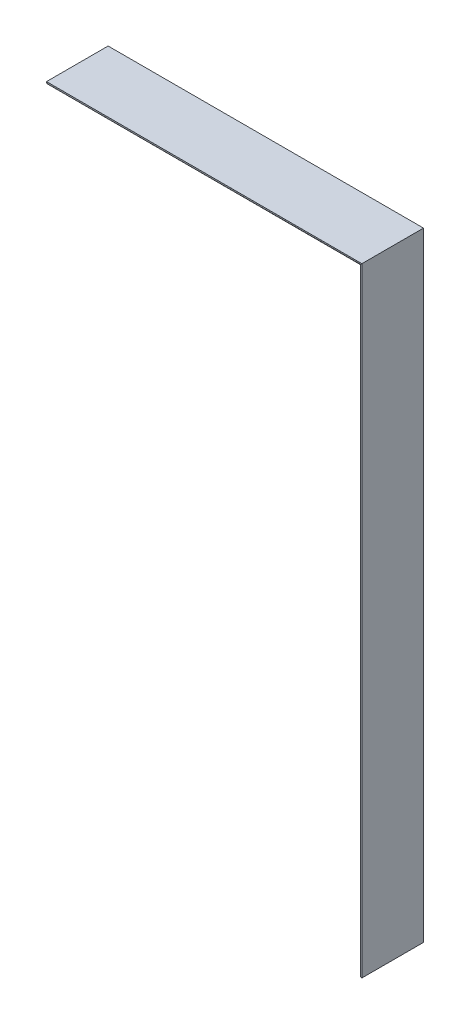
ISO-10303-21;
HEADER;
FILE_DESCRIPTION(('STEP AP214'),'2;1');
FILE_NAME('part.step','',(''),(''),'','','');
FILE_SCHEMA(('AUTOMOTIVE_DESIGN { 1 0 10303 214 1 1 1 1 }'));
ENDSEC;
DATA;
#1=APPLICATION_CONTEXT('core data for automotive mechanical design processes');
#2=APPLICATION_PROTOCOL_DEFINITION('international standard','automotive_design',2000,#1);
#3=PRODUCT_CONTEXT('',#1,'mechanical');
#4=PRODUCT('Part','Part','',(#3));
#5=PRODUCT_RELATED_PRODUCT_CATEGORY('part','',(#4));
#6=PRODUCT_DEFINITION_FORMATION('','',#4);
#7=PRODUCT_DEFINITION_CONTEXT('part definition',#1,'design');
#8=PRODUCT_DEFINITION('design','',#6,#7);
#9=PRODUCT_DEFINITION_SHAPE('','',#8);
#10=(LENGTH_UNIT() NAMED_UNIT(*) SI_UNIT(.MILLI.,.METRE.));
#11=(NAMED_UNIT(*) PLANE_ANGLE_UNIT() SI_UNIT($,.RADIAN.));
#12=(NAMED_UNIT(*) SI_UNIT($,.STERADIAN.) SOLID_ANGLE_UNIT());
#13=UNCERTAINTY_MEASURE_WITH_UNIT(LENGTH_MEASURE(1.E-05),#10,'distance_accuracy_value','');
#14=(GEOMETRIC_REPRESENTATION_CONTEXT(3) GLOBAL_UNCERTAINTY_ASSIGNED_CONTEXT((#13)) GLOBAL_UNIT_ASSIGNED_CONTEXT((#10,
#11,#12)) REPRESENTATION_CONTEXT('',''));
#15=CARTESIAN_POINT('',(0.,0.,0.));
#16=DIRECTION('',(0.,0.,1.));
#17=DIRECTION('',(1.,0.,0.));
#18=AXIS2_PLACEMENT_3D('',#15,#16,#17);
#19=CARTESIAN_POINT('',(-50.8,0.,0.));
#20=DIRECTION('',(0.,0.,1.));
#21=DIRECTION('',(1.,0.,0.));
#22=AXIS2_PLACEMENT_3D('',#19,#20,#21);
#23=PLANE('',#22);
#24=DIRECTION('',(-0.707106781186547,-0.707106781186548,0.));
#25=VECTOR('',#24,1.);
#26=CARTESIAN_POINT('',(-25.4,-25.4,0.));
#27=LINE('',#26,#25);
#28=CARTESIAN_POINT('',(0.,0.,0.));
#29=VERTEX_POINT('',#28);
#30=CARTESIAN_POINT('',(-50.8,-50.8,0.));
#31=VERTEX_POINT('',#30);
#32=EDGE_CURVE('E185',#29,#31,#27,.T.);
#33=ORIENTED_EDGE('',*,*,#32,.F.);
#34=DIRECTION('',(0.,-1.,0.));
#35=VECTOR('',#34,1.);
#36=CARTESIAN_POINT('',(0.,0.,0.));
#37=LINE('',#36,#35);
#38=CARTESIAN_POINT('',(0.,-510.,0.));
#39=VERTEX_POINT('',#38);
#40=EDGE_CURVE('E81',#29,#39,#37,.T.);
#41=ORIENTED_EDGE('',*,*,#40,.T.);
#42=DIRECTION('',(-1.,0.,0.));
#43=VECTOR('',#42,1.);
#44=CARTESIAN_POINT('',(-50.7999999999999,-510.,0.));
#45=LINE('',#44,#43);
#46=CARTESIAN_POINT('',(-50.7999999999999,-510.,0.));
#47=VERTEX_POINT('',#46);
#48=EDGE_CURVE('E193',#39,#47,#45,.T.);
#49=ORIENTED_EDGE('',*,*,#48,.T.);
#50=DIRECTION('',(0.,-1.,0.));
#51=VECTOR('',#50,1.);
#52=CARTESIAN_POINT('',(-50.8,0.,0.));
#53=LINE('',#52,#51);
#54=EDGE_CURVE('E136',#31,#47,#53,.T.);
#55=ORIENTED_EDGE('',*,*,#54,.F.);
#56=EDGE_LOOP('',(#33,#41,#49,#55));
#57=FACE_BOUND('',#56,.T.);
#58=ADVANCED_FACE('F77',(#57),#23,.F.);
#59=CARTESIAN_POINT('',(-50.8,0.,0.00508));
#60=DIRECTION('',(1.,0.,0.));
#61=DIRECTION('',(0.,1.,0.));
#62=AXIS2_PLACEMENT_3D('',#59,#60,#61);
#63=PLANE('',#62);
#64=DIRECTION('',(0.,0.,1.));
#65=VECTOR('',#64,1.);
#66=CARTESIAN_POINT('',(-50.8,-50.8,0.00508));
#67=LINE('',#66,#65);
#68=CARTESIAN_POINT('',(-50.8,-50.8,0.00508));
#69=VERTEX_POINT('',#68);
#70=EDGE_CURVE('E143',#31,#69,#67,.T.);
#71=ORIENTED_EDGE('',*,*,#70,.F.);
#72=ORIENTED_EDGE('',*,*,#54,.T.);
#73=DIRECTION('',(0.,0.,1.));
#74=VECTOR('',#73,1.);
#75=CARTESIAN_POINT('',(-50.7999999999999,-510.,0.00508));
#76=LINE('',#75,#74);
#77=CARTESIAN_POINT('',(-50.7999999999999,-510.,0.00508));
#78=VERTEX_POINT('',#77);
#79=EDGE_CURVE('E192',#47,#78,#76,.T.);
#80=ORIENTED_EDGE('',*,*,#79,.T.);
#81=DIRECTION('',(0.,-1.,0.));
#82=VECTOR('',#81,1.);
#83=CARTESIAN_POINT('',(-50.8,0.,0.00508));
#84=LINE('',#83,#82);
#85=EDGE_CURVE('E194',#69,#78,#84,.T.);
#86=ORIENTED_EDGE('',*,*,#85,.F.);
#87=EDGE_LOOP('',(#71,#72,#80,#86));
#88=FACE_BOUND('',#87,.T.);
#89=ADVANCED_FACE('F228',(#88),#63,.F.);
#90=CARTESIAN_POINT('',(-47.63008,0.,0.00507999999999961));
#91=DIRECTION('',(0.,-1.,0.));
#92=DIRECTION('',(1.,0.,0.));
#93=AXIS2_PLACEMENT_3D('',#90,#91,#92);
#94=CYLINDRICAL_SURFACE('',#93,3.16992);
#95=CARTESIAN_POINT('',(-47.63008,-47.63008,0.00507999999999961));
#96=DIRECTION('',(-0.707106781186548,0.707106781186547,0.));
#97=DIRECTION('',(-0.707106781186547,-0.707106781186548,0.));
#98=AXIS2_PLACEMENT_3D('',#95,#96,#97);
#99=ELLIPSE('',#98,4.48294385563772,3.16992);
#100=CARTESIAN_POINT('',(-47.63008,-47.63008,3.175));
#101=VERTEX_POINT('',#100);
#102=EDGE_CURVE('E181',#69,#101,#99,.T.);
#103=ORIENTED_EDGE('',*,*,#102,.F.);
#104=ORIENTED_EDGE('',*,*,#85,.T.);
#105=CARTESIAN_POINT('',(-47.6300799999999,-510.,0.00507999999999961));
#106=DIRECTION('',(0.,1.,0.));
#107=DIRECTION('',(-1.,0.,0.));
#108=AXIS2_PLACEMENT_3D('',#105,#106,#107);
#109=CIRCLE('',#108,3.16992);
#110=CARTESIAN_POINT('',(-47.6300799999999,-510.,3.175));
#111=VERTEX_POINT('',#110);
#112=EDGE_CURVE('E196',#78,#111,#109,.T.);
#113=ORIENTED_EDGE('',*,*,#112,.T.);
#114=DIRECTION('',(0.,-1.,0.));
#115=VECTOR('',#114,1.);
#116=CARTESIAN_POINT('',(-47.63008,0.,3.175));
#117=LINE('',#116,#115);
#118=EDGE_CURVE('E197',#101,#111,#117,.T.);
#119=ORIENTED_EDGE('',*,*,#118,.F.);
#120=EDGE_LOOP('',(#103,#104,#113,#119));
#121=FACE_BOUND('',#120,.T.);
#122=ADVANCED_FACE('F231',(#121),#94,.T.);
#123=CARTESIAN_POINT('',(-7.93750000000001,0.,3.17499999999999));
#124=DIRECTION('',(0.,0.,-1.));
#125=DIRECTION('',(-1.,0.,0.));
#126=AXIS2_PLACEMENT_3D('',#123,#124,#125);
#127=PLANE('',#126);
#128=DIRECTION('',(0.707106781186547,0.707106781186548,0.));
#129=VECTOR('',#128,1.);
#130=CARTESIAN_POINT('',(-3.96875000000001,-3.96875000000001,3.17499999999999));
#131=LINE('',#130,#129);
#132=CARTESIAN_POINT('',(-7.93750000000001,-7.93750000000002,3.17499999999999));
#133=VERTEX_POINT('',#132);
#134=EDGE_CURVE('E178',#101,#133,#131,.T.);
#135=ORIENTED_EDGE('',*,*,#134,.F.);
#136=ORIENTED_EDGE('',*,*,#118,.T.);
#137=DIRECTION('',(1.,0.,0.));
#138=VECTOR('',#137,1.);
#139=CARTESIAN_POINT('',(-7.93749999999995,-510.,3.17499999999999));
#140=LINE('',#139,#138);
#141=CARTESIAN_POINT('',(-7.93749999999995,-510.,3.17499999999999));
#142=VERTEX_POINT('',#141);
#143=EDGE_CURVE('E199',#111,#142,#140,.T.);
#144=ORIENTED_EDGE('',*,*,#143,.T.);
#145=DIRECTION('',(0.,-1.,0.));
#146=VECTOR('',#145,1.);
#147=CARTESIAN_POINT('',(-7.93750000000002,0.,3.17499999999999));
#148=LINE('',#147,#146);
#149=EDGE_CURVE('E200',#133,#142,#148,.T.);
#150=ORIENTED_EDGE('',*,*,#149,.F.);
#151=EDGE_LOOP('',(#135,#136,#144,#150));
#152=FACE_BOUND('',#151,.T.);
#153=ADVANCED_FACE('F233',(#152),#127,.F.);
#154=CARTESIAN_POINT('',(-7.93750000000001,0.,7.93749999999999));
#155=DIRECTION('',(0.,-1.,0.));
#156=DIRECTION('',(1.,0.,0.));
#157=AXIS2_PLACEMENT_3D('',#154,#155,#156);
#158=CYLINDRICAL_SURFACE('',#157,4.7625);
#159=CARTESIAN_POINT('',(-7.93750000000001,-7.93750000000001,7.93749999999999));
#160=DIRECTION('',(-0.707106781186548,0.707106781186547,0.));
#161=DIRECTION('',(-0.707106781186547,-0.707106781186548,0.));
#162=AXIS2_PLACEMENT_3D('',#159,#160,#161);
#163=ELLIPSE('',#162,6.73519209080187,4.7625);
#164=CARTESIAN_POINT('',(-3.17500000000001,-3.17500000000001,7.93749999999999));
#165=VERTEX_POINT('',#164);
#166=EDGE_CURVE('E173',#133,#165,#163,.F.);
#167=ORIENTED_EDGE('',*,*,#166,.F.);
#168=ORIENTED_EDGE('',*,*,#149,.T.);
#169=CARTESIAN_POINT('',(-7.93749999999995,-510.,7.93749999999999));
#170=DIRECTION('',(0.,-1.,0.));
#171=DIRECTION('',(1.,0.,0.));
#172=AXIS2_PLACEMENT_3D('',#169,#170,#171);
#173=CIRCLE('',#172,4.7625);
#174=CARTESIAN_POINT('',(-3.17499999999995,-510.,7.93749999999999));
#175=VERTEX_POINT('',#174);
#176=EDGE_CURVE('E202',#142,#175,#173,.T.);
#177=ORIENTED_EDGE('',*,*,#176,.T.);
#178=DIRECTION('',(0.,-1.,0.));
#179=VECTOR('',#178,1.);
#180=CARTESIAN_POINT('',(-3.17500000000001,0.,7.93749999999999));
#181=LINE('',#180,#179);
#182=EDGE_CURVE('E203',#165,#175,#181,.T.);
#183=ORIENTED_EDGE('',*,*,#182,.F.);
#184=EDGE_LOOP('',(#167,#168,#177,#183));
#185=FACE_BOUND('',#184,.T.);
#186=ADVANCED_FACE('F237',(#185),#158,.F.);
#187=CARTESIAN_POINT('',(-3.175,0.,47.63008));
#188=DIRECTION('',(1.,0.,0.));
#189=DIRECTION('',(0.,0.,-1.));
#190=AXIS2_PLACEMENT_3D('',#187,#188,#189);
#191=PLANE('',#190);
#192=DIRECTION('',(0.,0.,1.));
#193=VECTOR('',#192,1.);
#194=CARTESIAN_POINT('',(-3.175,-3.175,47.63008));
#195=LINE('',#194,#193);
#196=CARTESIAN_POINT('',(-3.17499999999999,-3.175,47.63008));
#197=VERTEX_POINT('',#196);
#198=EDGE_CURVE('E171',#165,#197,#195,.T.);
#199=ORIENTED_EDGE('',*,*,#198,.F.);
#200=ORIENTED_EDGE('',*,*,#182,.T.);
#201=DIRECTION('',(0.,0.,1.));
#202=VECTOR('',#201,1.);
#203=CARTESIAN_POINT('',(-3.17499999999994,-510.,47.63008));
#204=LINE('',#203,#202);
#205=CARTESIAN_POINT('',(-3.17499999999993,-510.,47.63008));
#206=VERTEX_POINT('',#205);
#207=EDGE_CURVE('E205',#175,#206,#204,.T.);
#208=ORIENTED_EDGE('',*,*,#207,.T.);
#209=DIRECTION('',(0.,-1.,0.));
#210=VECTOR('',#209,1.);
#211=CARTESIAN_POINT('',(-3.175,0.,47.63008));
#212=LINE('',#211,#210);
#213=EDGE_CURVE('E206',#197,#206,#212,.T.);
#214=ORIENTED_EDGE('',*,*,#213,.F.);
#215=EDGE_LOOP('',(#199,#200,#208,#214));
#216=FACE_BOUND('',#215,.T.);
#217=ADVANCED_FACE('F241',(#216),#191,.F.);
#218=CARTESIAN_POINT('',(-0.00508000000000019,0.,47.63008));
#219=DIRECTION('',(0.,-1.,0.));
#220=DIRECTION('',(1.,0.,0.));
#221=AXIS2_PLACEMENT_3D('',#218,#219,#220);
#222=CYLINDRICAL_SURFACE('',#221,3.16992);
#223=CARTESIAN_POINT('',(-0.00508000000000019,-0.00508000000000019,47.63008));
#224=DIRECTION('',(-0.707106781186548,0.707106781186547,0.));
#225=DIRECTION('',(-0.707106781186547,-0.707106781186548,0.));
#226=AXIS2_PLACEMENT_3D('',#223,#224,#225);
#227=ELLIPSE('',#226,4.48294385563772,3.16992);
#228=CARTESIAN_POINT('',(-0.00508,-0.00508,50.8));
#229=VERTEX_POINT('',#228);
#230=EDGE_CURVE('E86',#197,#229,#227,.T.);
#231=ORIENTED_EDGE('',*,*,#230,.F.);
#232=ORIENTED_EDGE('',*,*,#213,.T.);
#233=CARTESIAN_POINT('',(-0.00507999999993774,-510.,47.63008));
#234=DIRECTION('',(0.,1.,0.));
#235=DIRECTION('',(1.,0.,0.));
#236=AXIS2_PLACEMENT_3D('',#233,#234,#235);
#237=CIRCLE('',#236,3.16992);
#238=CARTESIAN_POINT('',(-0.00507999999993754,-510.,50.8));
#239=VERTEX_POINT('',#238);
#240=EDGE_CURVE('E165',#206,#239,#237,.T.);
#241=ORIENTED_EDGE('',*,*,#240,.T.);
#242=DIRECTION('',(0.,-1.,0.));
#243=VECTOR('',#242,1.);
#244=CARTESIAN_POINT('',(-0.00508,0.,50.8));
#245=LINE('',#244,#243);
#246=EDGE_CURVE('E156',#229,#239,#245,.T.);
#247=ORIENTED_EDGE('',*,*,#246,.F.);
#248=EDGE_LOOP('',(#231,#232,#241,#247));
#249=FACE_BOUND('',#248,.T.);
#250=ADVANCED_FACE('F162',(#249),#222,.T.);
#251=CARTESIAN_POINT('',(0.,0.,50.8));
#252=DIRECTION('',(0.,0.,-1.));
#253=DIRECTION('',(-1.,0.,0.));
#254=AXIS2_PLACEMENT_3D('',#251,#252,#253);
#255=PLANE('',#254);
#256=DIRECTION('',(0.707106781186547,0.707106781186548,0.));
#257=VECTOR('',#256,1.);
#258=CARTESIAN_POINT('',(0.,0.,50.8));
#259=LINE('',#258,#257);
#260=CARTESIAN_POINT('',(0.,0.,50.8));
#261=VERTEX_POINT('',#260);
#262=EDGE_CURVE('E14',#229,#261,#259,.T.);
#263=ORIENTED_EDGE('',*,*,#262,.F.);
#264=ORIENTED_EDGE('',*,*,#246,.T.);
#265=DIRECTION('',(1.,0.,0.));
#266=VECTOR('',#265,1.);
#267=CARTESIAN_POINT('',(0.,-510.,50.8));
#268=LINE('',#267,#266);
#269=CARTESIAN_POINT('',(0.,-510.,50.8));
#270=VERTEX_POINT('',#269);
#271=EDGE_CURVE('E167',#239,#270,#268,.T.);
#272=ORIENTED_EDGE('',*,*,#271,.T.);
#273=DIRECTION('',(0.,-1.,0.));
#274=VECTOR('',#273,1.);
#275=CARTESIAN_POINT('',(0.,0.,50.8));
#276=LINE('',#275,#274);
#277=EDGE_CURVE('E99',#261,#270,#276,.T.);
#278=ORIENTED_EDGE('',*,*,#277,.F.);
#279=EDGE_LOOP('',(#263,#264,#272,#278));
#280=FACE_BOUND('',#279,.T.);
#281=ADVANCED_FACE('F155',(#280),#255,.F.);
#282=CARTESIAN_POINT('',(0.,0.,0.));
#283=DIRECTION('',(-1.,0.,0.));
#284=DIRECTION('',(0.,-1.,0.));
#285=AXIS2_PLACEMENT_3D('',#282,#283,#284);
#286=PLANE('',#285);
#287=DIRECTION('',(0.,0.,-1.));
#288=VECTOR('',#287,1.);
#289=CARTESIAN_POINT('',(0.,0.,0.));
#290=LINE('',#289,#288);
#291=EDGE_CURVE('E188',#261,#29,#290,.T.);
#292=ORIENTED_EDGE('',*,*,#291,.F.);
#293=ORIENTED_EDGE('',*,*,#277,.T.);
#294=DIRECTION('',(0.,0.,-1.));
#295=VECTOR('',#294,1.);
#296=CARTESIAN_POINT('',(0.,-510.,0.));
#297=LINE('',#296,#295);
#298=EDGE_CURVE('E190',#270,#39,#297,.T.);
#299=ORIENTED_EDGE('',*,*,#298,.T.);
#300=ORIENTED_EDGE('',*,*,#40,.F.);
#301=EDGE_LOOP('',(#292,#293,#299,#300));
#302=FACE_BOUND('',#301,.T.);
#303=ADVANCED_FACE('F223',(#302),#286,.F.);
#304=CARTESIAN_POINT('',(-0.00507999999993774,-510.,47.63008));
#305=DIRECTION('',(0.,-1.,0.));
#306=DIRECTION('',(1.,0.,0.));
#307=AXIS2_PLACEMENT_3D('',#304,#305,#306);
#308=PLANE('',#307);
#309=ORIENTED_EDGE('',*,*,#48,.F.);
#310=ORIENTED_EDGE('',*,*,#298,.F.);
#311=ORIENTED_EDGE('',*,*,#271,.F.);
#312=ORIENTED_EDGE('',*,*,#240,.F.);
#313=ORIENTED_EDGE('',*,*,#207,.F.);
#314=ORIENTED_EDGE('',*,*,#176,.F.);
#315=ORIENTED_EDGE('',*,*,#143,.F.);
#316=ORIENTED_EDGE('',*,*,#112,.F.);
#317=ORIENTED_EDGE('',*,*,#79,.F.);
#318=EDGE_LOOP('',(#309,#310,#311,#312,#313,#314,#315,#316,#317));
#319=FACE_BOUND('',#318,.T.);
#320=ADVANCED_FACE('F225',(#319),#308,.T.);
#321=CARTESIAN_POINT('',(0.,0.,0.));
#322=DIRECTION('',(-0.707106781186548,0.707106781186547,0.));
#323=DIRECTION('',(-0.707106781186547,-0.707106781186548,0.));
#324=AXIS2_PLACEMENT_3D('',#321,#322,#323);
#325=PLANE('',#324);
#326=ORIENTED_EDGE('',*,*,#291,.T.);
#327=ORIENTED_EDGE('',*,*,#32,.T.);
#328=ORIENTED_EDGE('',*,*,#70,.T.);
#329=ORIENTED_EDGE('',*,*,#102,.T.);
#330=ORIENTED_EDGE('',*,*,#134,.T.);
#331=ORIENTED_EDGE('',*,*,#166,.T.);
#332=ORIENTED_EDGE('',*,*,#198,.T.);
#333=ORIENTED_EDGE('',*,*,#230,.T.);
#334=ORIENTED_EDGE('',*,*,#262,.T.);
#335=EDGE_LOOP('',(#326,#327,#328,#329,#330,#331,#332,#333,#334));
#336=FACE_BOUND('',#335,.T.);
#337=ADVANCED_FACE('F79',(#336),#325,.T.);
#338=CLOSED_SHELL('',(#58,#89,#122,#153,#186,#217,#250,#281,#303,#320,#337));
#339=MANIFOLD_SOLID_BREP('B2',#338);
#340=CARTESIAN_POINT('',(-260.,-50.8,0.));
#341=DIRECTION('',(0.,0.,1.));
#342=DIRECTION('',(1.,0.,0.));
#343=AXIS2_PLACEMENT_3D('',#340,#341,#342);
#344=PLANE('',#343);
#345=DIRECTION('',(0.707106781186547,0.707106781186548,0.));
#346=VECTOR('',#345,1.);
#347=CARTESIAN_POINT('',(-155.4,-155.4,0.));
#348=LINE('',#347,#346);
#349=CARTESIAN_POINT('',(-50.8,-50.8,0.));
#350=VERTEX_POINT('',#349);
#351=CARTESIAN_POINT('',(0.,0.,0.));
#352=VERTEX_POINT('',#351);
#353=EDGE_CURVE('E470',#350,#352,#348,.T.);
#354=ORIENTED_EDGE('',*,*,#353,.F.);
#355=DIRECTION('',(1.,0.,0.));
#356=VECTOR('',#355,1.);
#357=CARTESIAN_POINT('',(-260.,-50.8,0.));
#358=LINE('',#357,#356);
#359=CARTESIAN_POINT('',(-260.,-50.8,0.));
#360=VERTEX_POINT('',#359);
#361=EDGE_CURVE('E475',#360,#350,#358,.T.);
#362=ORIENTED_EDGE('',*,*,#361,.F.);
#363=DIRECTION('',(0.,-1.,0.));
#364=VECTOR('',#363,1.);
#365=CARTESIAN_POINT('',(-260.,-50.8,0.));
#366=LINE('',#365,#364);
#367=CARTESIAN_POINT('',(-260.,0.,0.));
#368=VERTEX_POINT('',#367);
#369=EDGE_CURVE('E462',#368,#360,#366,.T.);
#370=ORIENTED_EDGE('',*,*,#369,.F.);
#371=DIRECTION('',(1.,0.,0.));
#372=VECTOR('',#371,1.);
#373=CARTESIAN_POINT('',(-260.,0.,0.));
#374=LINE('',#373,#372);
#375=EDGE_CURVE('E371',#368,#352,#374,.T.);
#376=ORIENTED_EDGE('',*,*,#375,.T.);
#377=EDGE_LOOP('',(#354,#362,#370,#376));
#378=FACE_BOUND('',#377,.T.);
#379=ADVANCED_FACE('F367',(#378),#344,.F.);
#380=CARTESIAN_POINT('',(-260.,-50.8,0.00508));
#381=DIRECTION('',(0.,1.,0.));
#382=DIRECTION('',(-1.,0.,0.));
#383=AXIS2_PLACEMENT_3D('',#380,#381,#382);
#384=PLANE('',#383);
#385=DIRECTION('',(0.,0.,-1.));
#386=VECTOR('',#385,1.);
#387=CARTESIAN_POINT('',(-50.8,-50.8,0.00508));
#388=LINE('',#387,#386);
#389=CARTESIAN_POINT('',(-50.8,-50.8,0.00508));
#390=VERTEX_POINT('',#389);
#391=EDGE_CURVE('E425',#390,#350,#388,.T.);
#392=ORIENTED_EDGE('',*,*,#391,.F.);
#393=DIRECTION('',(1.,0.,0.));
#394=VECTOR('',#393,1.);
#395=CARTESIAN_POINT('',(-260.,-50.8,0.00508));
#396=LINE('',#395,#394);
#397=CARTESIAN_POINT('',(-260.,-50.8,0.00508));
#398=VERTEX_POINT('',#397);
#399=EDGE_CURVE('E477',#398,#390,#396,.T.);
#400=ORIENTED_EDGE('',*,*,#399,.F.);
#401=DIRECTION('',(0.,0.,1.));
#402=VECTOR('',#401,1.);
#403=CARTESIAN_POINT('',(-260.,-50.8,0.00508));
#404=LINE('',#403,#402);
#405=EDGE_CURVE('E417',#360,#398,#404,.T.);
#406=ORIENTED_EDGE('',*,*,#405,.F.);
#407=ORIENTED_EDGE('',*,*,#361,.T.);
#408=EDGE_LOOP('',(#392,#400,#406,#407));
#409=FACE_BOUND('',#408,.T.);
#410=ADVANCED_FACE('F528',(#409),#384,.F.);
#411=CARTESIAN_POINT('',(-260.,-47.63008,0.00507999999999961));
#412=DIRECTION('',(1.,0.,0.));
#413=DIRECTION('',(0.,1.,0.));
#414=AXIS2_PLACEMENT_3D('',#411,#412,#413);
#415=CYLINDRICAL_SURFACE('',#414,3.16992);
#416=CARTESIAN_POINT('',(-47.63008,-47.63008,0.00507999999999961));
#417=DIRECTION('',(0.707106781186548,-0.707106781186547,0.));
#418=DIRECTION('',(0.707106781186547,0.707106781186548,0.));
#419=AXIS2_PLACEMENT_3D('',#416,#417,#418);
#420=ELLIPSE('',#419,4.48294385563772,3.16992);
#421=CARTESIAN_POINT('',(-47.63008,-47.63008,3.175));
#422=VERTEX_POINT('',#421);
#423=EDGE_CURVE('E75',#422,#390,#420,.T.);
#424=ORIENTED_EDGE('',*,*,#423,.F.);
#425=DIRECTION('',(1.,0.,0.));
#426=VECTOR('',#425,1.);
#427=CARTESIAN_POINT('',(-260.,-47.63008,3.175));
#428=LINE('',#427,#426);
#429=CARTESIAN_POINT('',(-260.,-47.63008,3.175));
#430=VERTEX_POINT('',#429);
#431=EDGE_CURVE('E479',#430,#422,#428,.T.);
#432=ORIENTED_EDGE('',*,*,#431,.F.);
#433=CARTESIAN_POINT('',(-260.,-47.63008,0.00507999999999961));
#434=DIRECTION('',(-1.,0.,0.));
#435=DIRECTION('',(0.,-1.,0.));
#436=AXIS2_PLACEMENT_3D('',#433,#434,#435);
#437=CIRCLE('',#436,3.16992);
#438=EDGE_CURVE('E503',#398,#430,#437,.T.);
#439=ORIENTED_EDGE('',*,*,#438,.F.);
#440=ORIENTED_EDGE('',*,*,#399,.T.);
#441=EDGE_LOOP('',(#424,#432,#439,#440));
#442=FACE_BOUND('',#441,.T.);
#443=ADVANCED_FACE('F527',(#442),#415,.T.);
#444=CARTESIAN_POINT('',(-260.,-7.93750000000005,3.17499999999999));
#445=DIRECTION('',(0.,0.,-1.));
#446=DIRECTION('',(0.,1.,0.));
#447=AXIS2_PLACEMENT_3D('',#444,#445,#446);
#448=PLANE('',#447);
#449=DIRECTION('',(-0.707106781186547,-0.707106781186548,0.));
#450=VECTOR('',#449,1.);
#451=CARTESIAN_POINT('',(-133.96875,-133.96875,3.17500000000001));
#452=LINE('',#451,#450);
#453=CARTESIAN_POINT('',(-7.93749999999999,-7.93750000000002,3.17499999999999));
#454=VERTEX_POINT('',#453);
#455=EDGE_CURVE('E377',#454,#422,#452,.T.);
#456=ORIENTED_EDGE('',*,*,#455,.F.);
#457=DIRECTION('',(1.,0.,0.));
#458=VECTOR('',#457,1.);
#459=CARTESIAN_POINT('',(-260.,-7.93750000000005,3.17499999999999));
#460=LINE('',#459,#458);
#461=CARTESIAN_POINT('',(-260.,-7.93750000000005,3.17499999999999));
#462=VERTEX_POINT('',#461);
#463=EDGE_CURVE('E482',#462,#454,#460,.T.);
#464=ORIENTED_EDGE('',*,*,#463,.F.);
#465=DIRECTION('',(0.,1.,0.));
#466=VECTOR('',#465,1.);
#467=CARTESIAN_POINT('',(-260.,-7.93750000000005,3.17499999999999));
#468=LINE('',#467,#466);
#469=EDGE_CURVE('E505',#430,#462,#468,.T.);
#470=ORIENTED_EDGE('',*,*,#469,.F.);
#471=ORIENTED_EDGE('',*,*,#431,.T.);
#472=EDGE_LOOP('',(#456,#464,#470,#471));
#473=FACE_BOUND('',#472,.T.);
#474=ADVANCED_FACE('F522',(#473),#448,.F.);
#475=CARTESIAN_POINT('',(-260.,-7.93750000000005,7.93749999999999));
#476=DIRECTION('',(1.,0.,0.));
#477=DIRECTION('',(0.,1.,0.));
#478=AXIS2_PLACEMENT_3D('',#475,#476,#477);
#479=CYLINDRICAL_SURFACE('',#478,4.7625);
#480=CARTESIAN_POINT('',(-7.93749999999999,-7.93750000000001,7.93749999999999));
#481=DIRECTION('',(0.707106781186548,-0.707106781186547,0.));
#482=DIRECTION('',(0.707106781186547,0.707106781186548,0.));
#483=AXIS2_PLACEMENT_3D('',#480,#481,#482);
#484=ELLIPSE('',#483,6.73519209080187,4.7625);
#485=CARTESIAN_POINT('',(-3.17499999999998,-3.17500000000001,7.93749999999999));
#486=VERTEX_POINT('',#485);
#487=EDGE_CURVE('E494',#486,#454,#484,.F.);
#488=ORIENTED_EDGE('',*,*,#487,.F.);
#489=DIRECTION('',(1.,0.,0.));
#490=VECTOR('',#489,1.);
#491=CARTESIAN_POINT('',(-260.,-3.17500000000005,7.93749999999999));
#492=LINE('',#491,#490);
#493=CARTESIAN_POINT('',(-260.,-3.17500000000005,7.93749999999999));
#494=VERTEX_POINT('',#493);
#495=EDGE_CURVE('E485',#494,#486,#492,.T.);
#496=ORIENTED_EDGE('',*,*,#495,.F.);
#497=CARTESIAN_POINT('',(-260.,-7.93750000000005,7.93749999999999));
#498=DIRECTION('',(1.,0.,0.));
#499=DIRECTION('',(0.,1.,0.));
#500=AXIS2_PLACEMENT_3D('',#497,#498,#499);
#501=CIRCLE('',#500,4.7625);
#502=EDGE_CURVE('E507',#462,#494,#501,.T.);
#503=ORIENTED_EDGE('',*,*,#502,.F.);
#504=ORIENTED_EDGE('',*,*,#463,.T.);
#505=EDGE_LOOP('',(#488,#496,#503,#504));
#506=FACE_BOUND('',#505,.T.);
#507=ADVANCED_FACE('F519',(#506),#479,.F.);
#508=CARTESIAN_POINT('',(-260.,-3.17500000000003,47.63008));
#509=DIRECTION('',(0.,1.,0.));
#510=DIRECTION('',(0.,0.,1.));
#511=AXIS2_PLACEMENT_3D('',#508,#509,#510);
#512=PLANE('',#511);
#513=DIRECTION('',(0.,0.,-1.));
#514=VECTOR('',#513,1.);
#515=CARTESIAN_POINT('',(-3.17499999999998,-3.175,47.6300799999999));
#516=LINE('',#515,#514);
#517=CARTESIAN_POINT('',(-3.17499999999993,-3.175,47.63008));
#518=VERTEX_POINT('',#517);
#519=EDGE_CURVE('E442',#518,#486,#516,.T.);
#520=ORIENTED_EDGE('',*,*,#519,.F.);
#521=DIRECTION('',(1.,0.,0.));
#522=VECTOR('',#521,1.);
#523=CARTESIAN_POINT('',(-260.,-3.17500000000003,47.63008));
#524=LINE('',#523,#522);
#525=CARTESIAN_POINT('',(-260.,-3.17500000000003,47.63008));
#526=VERTEX_POINT('',#525);
#527=EDGE_CURVE('E487',#526,#518,#524,.T.);
#528=ORIENTED_EDGE('',*,*,#527,.F.);
#529=DIRECTION('',(0.,0.,1.));
#530=VECTOR('',#529,1.);
#531=CARTESIAN_POINT('',(-260.,-3.17500000000003,47.63008));
#532=LINE('',#531,#530);
#533=EDGE_CURVE('E509',#494,#526,#532,.T.);
#534=ORIENTED_EDGE('',*,*,#533,.F.);
#535=ORIENTED_EDGE('',*,*,#495,.T.);
#536=EDGE_LOOP('',(#520,#528,#534,#535));
#537=FACE_BOUND('',#536,.T.);
#538=ADVANCED_FACE('F517',(#537),#512,.F.);
#539=CARTESIAN_POINT('',(-260.,-0.00508000000003204,47.63008));
#540=DIRECTION('',(1.,0.,0.));
#541=DIRECTION('',(0.,1.,0.));
#542=AXIS2_PLACEMENT_3D('',#539,#540,#541);
#543=CYLINDRICAL_SURFACE('',#542,3.16992);
#544=CARTESIAN_POINT('',(-0.00507999999999065,-0.0050800000000002,47.63008));
#545=DIRECTION('',(0.707106781186548,-0.707106781186547,0.));
#546=DIRECTION('',(0.707106781186547,0.707106781186548,0.));
#547=AXIS2_PLACEMENT_3D('',#544,#545,#546);
#548=ELLIPSE('',#547,4.48294385563772,3.16992);
#549=CARTESIAN_POINT('',(-0.00508000000004616,-0.0050800000000092,50.8));
#550=VERTEX_POINT('',#549);
#551=EDGE_CURVE('E448',#550,#518,#548,.T.);
#552=ORIENTED_EDGE('',*,*,#551,.F.);
#553=DIRECTION('',(1.,0.,0.));
#554=VECTOR('',#553,1.);
#555=CARTESIAN_POINT('',(-260.,-0.00508000000003184,50.8));
#556=LINE('',#555,#554);
#557=CARTESIAN_POINT('',(-260.,-0.00508000000003184,50.8));
#558=VERTEX_POINT('',#557);
#559=EDGE_CURVE('E463',#558,#550,#556,.T.);
#560=ORIENTED_EDGE('',*,*,#559,.F.);
#561=CARTESIAN_POINT('',(-260.,-0.00508000000003204,47.63008));
#562=DIRECTION('',(-1.,0.,0.));
#563=DIRECTION('',(0.,1.,0.));
#564=AXIS2_PLACEMENT_3D('',#561,#562,#563);
#565=CIRCLE('',#564,3.16992);
#566=EDGE_CURVE('E491',#526,#558,#565,.T.);
#567=ORIENTED_EDGE('',*,*,#566,.F.);
#568=ORIENTED_EDGE('',*,*,#527,.T.);
#569=EDGE_LOOP('',(#552,#560,#567,#568));
#570=FACE_BOUND('',#569,.T.);
#571=ADVANCED_FACE('F490',(#570),#543,.T.);
#572=CARTESIAN_POINT('',(-260.,0.,50.8));
#573=DIRECTION('',(0.,0.,-1.));
#574=DIRECTION('',(-1.,0.,0.));
#575=AXIS2_PLACEMENT_3D('',#572,#573,#574);
#576=PLANE('',#575);
#577=DIRECTION('',(-0.707106781186547,-0.707106781186548,0.));
#578=VECTOR('',#577,1.);
#579=CARTESIAN_POINT('',(-130.,-130.,50.8));
#580=LINE('',#579,#578);
#581=CARTESIAN_POINT('',(0.,0.,50.8));
#582=VERTEX_POINT('',#581);
#583=EDGE_CURVE('E465',#582,#550,#580,.T.);
#584=ORIENTED_EDGE('',*,*,#583,.F.);
#585=DIRECTION('',(1.,0.,0.));
#586=VECTOR('',#585,1.);
#587=CARTESIAN_POINT('',(-260.,0.,50.8));
#588=LINE('',#587,#586);
#589=CARTESIAN_POINT('',(-260.,0.,50.8));
#590=VERTEX_POINT('',#589);
#591=EDGE_CURVE('E454',#590,#582,#588,.T.);
#592=ORIENTED_EDGE('',*,*,#591,.F.);
#593=DIRECTION('',(0.,1.,0.));
#594=VECTOR('',#593,1.);
#595=CARTESIAN_POINT('',(-260.,0.,50.8));
#596=LINE('',#595,#594);
#597=EDGE_CURVE('E512',#558,#590,#596,.T.);
#598=ORIENTED_EDGE('',*,*,#597,.F.);
#599=ORIENTED_EDGE('',*,*,#559,.T.);
#600=EDGE_LOOP('',(#584,#592,#598,#599));
#601=FACE_BOUND('',#600,.T.);
#602=ADVANCED_FACE('F466',(#601),#576,.F.);
#603=CARTESIAN_POINT('',(-260.,0.,0.));
#604=DIRECTION('',(0.,-1.,0.));
#605=DIRECTION('',(1.,0.,0.));
#606=AXIS2_PLACEMENT_3D('',#603,#604,#605);
#607=PLANE('',#606);
#608=DIRECTION('',(0.,0.,1.));
#609=VECTOR('',#608,1.);
#610=CARTESIAN_POINT('',(0.,0.,0.));
#611=LINE('',#610,#609);
#612=EDGE_CURVE('E458',#352,#582,#611,.T.);
#613=ORIENTED_EDGE('',*,*,#612,.F.);
#614=ORIENTED_EDGE('',*,*,#375,.F.);
#615=DIRECTION('',(0.,0.,-1.));
#616=VECTOR('',#615,1.);
#617=CARTESIAN_POINT('',(-260.,0.,0.));
#618=LINE('',#617,#616);
#619=EDGE_CURVE('E386',#590,#368,#618,.T.);
#620=ORIENTED_EDGE('',*,*,#619,.F.);
#621=ORIENTED_EDGE('',*,*,#591,.T.);
#622=EDGE_LOOP('',(#613,#614,#620,#621));
#623=FACE_BOUND('',#622,.T.);
#624=ADVANCED_FACE('F456',(#623),#607,.F.);
#625=CARTESIAN_POINT('',(-260.,-0.00508000000003204,47.63008));
#626=DIRECTION('',(1.,0.,0.));
#627=DIRECTION('',(0.,1.,0.));
#628=AXIS2_PLACEMENT_3D('',#625,#626,#627);
#629=PLANE('',#628);
#630=ORIENTED_EDGE('',*,*,#369,.T.);
#631=ORIENTED_EDGE('',*,*,#405,.T.);
#632=ORIENTED_EDGE('',*,*,#438,.T.);
#633=ORIENTED_EDGE('',*,*,#469,.T.);
#634=ORIENTED_EDGE('',*,*,#502,.T.);
#635=ORIENTED_EDGE('',*,*,#533,.T.);
#636=ORIENTED_EDGE('',*,*,#566,.T.);
#637=ORIENTED_EDGE('',*,*,#597,.T.);
#638=ORIENTED_EDGE('',*,*,#619,.T.);
#639=EDGE_LOOP('',(#630,#631,#632,#633,#634,#635,#636,#637,#638));
#640=FACE_BOUND('',#639,.T.);
#641=ADVANCED_FACE('F514',(#640),#629,.F.);
#642=CARTESIAN_POINT('',(0.,0.,0.));
#643=DIRECTION('',(0.707106781186548,-0.707106781186547,0.));
#644=DIRECTION('',(0.707106781186547,0.707106781186548,0.));
#645=AXIS2_PLACEMENT_3D('',#642,#643,#644);
#646=PLANE('',#645);
#647=ORIENTED_EDGE('',*,*,#391,.T.);
#648=ORIENTED_EDGE('',*,*,#353,.T.);
#649=ORIENTED_EDGE('',*,*,#612,.T.);
#650=ORIENTED_EDGE('',*,*,#583,.T.);
#651=ORIENTED_EDGE('',*,*,#551,.T.);
#652=ORIENTED_EDGE('',*,*,#519,.T.);
#653=ORIENTED_EDGE('',*,*,#487,.T.);
#654=ORIENTED_EDGE('',*,*,#455,.T.);
#655=ORIENTED_EDGE('',*,*,#423,.T.);
#656=EDGE_LOOP('',(#647,#648,#649,#650,#651,#652,#653,#654,#655));
#657=FACE_BOUND('',#656,.T.);
#658=ADVANCED_FACE('F369',(#657),#646,.T.);
#659=CLOSED_SHELL('',(#379,#410,#443,#474,#507,#538,#571,#602,#624,#641,#658));
#660=MANIFOLD_SOLID_BREP('B8',#659);
#661=ADVANCED_BREP_SHAPE_REPRESENTATION('',(#18,#339,#660),#14);
#662=SHAPE_DEFINITION_REPRESENTATION(#9,#661);
ENDSEC;
END-ISO-10303-21;
